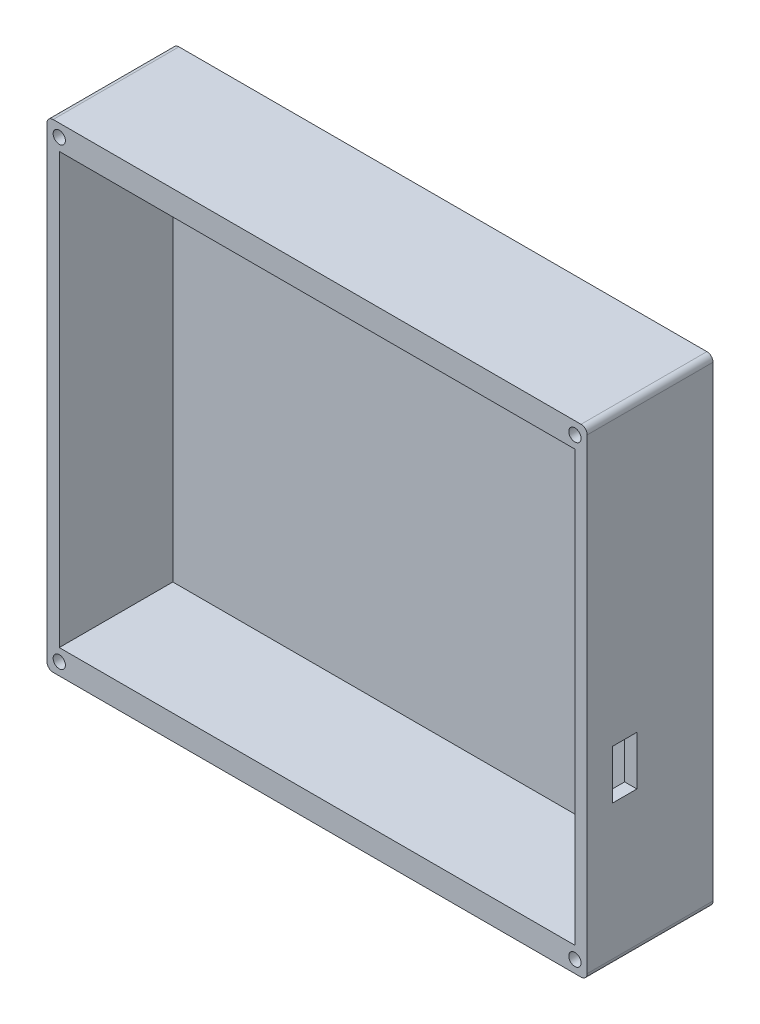
ISO-10303-21;
HEADER;
FILE_DESCRIPTION(('STEP AP214'),'2;1');
FILE_NAME('part.step','',(''),(''),'','','');
FILE_SCHEMA(('AUTOMOTIVE_DESIGN { 1 0 10303 214 1 1 1 1 }'));
ENDSEC;
DATA;
#1=APPLICATION_CONTEXT('core data for automotive mechanical design processes');
#2=APPLICATION_PROTOCOL_DEFINITION('international standard','automotive_design',2000,#1);
#3=PRODUCT_CONTEXT('',#1,'mechanical');
#4=PRODUCT('Part','Part','',(#3));
#5=PRODUCT_RELATED_PRODUCT_CATEGORY('part','',(#4));
#6=PRODUCT_DEFINITION_FORMATION('','',#4);
#7=PRODUCT_DEFINITION_CONTEXT('part definition',#1,'design');
#8=PRODUCT_DEFINITION('design','',#6,#7);
#9=PRODUCT_DEFINITION_SHAPE('','',#8);
#10=(LENGTH_UNIT() NAMED_UNIT(*) SI_UNIT(.MILLI.,.METRE.));
#11=(NAMED_UNIT(*) PLANE_ANGLE_UNIT() SI_UNIT($,.RADIAN.));
#12=(NAMED_UNIT(*) SI_UNIT($,.STERADIAN.) SOLID_ANGLE_UNIT());
#13=UNCERTAINTY_MEASURE_WITH_UNIT(LENGTH_MEASURE(1.E-05),#10,'distance_accuracy_value','');
#14=(GEOMETRIC_REPRESENTATION_CONTEXT(3) GLOBAL_UNCERTAINTY_ASSIGNED_CONTEXT((#13)) GLOBAL_UNIT_ASSIGNED_CONTEXT((#10,
#11,#12)) REPRESENTATION_CONTEXT('',''));
#15=CARTESIAN_POINT('',(0.,0.,0.));
#16=DIRECTION('',(0.,0.,1.));
#17=DIRECTION('',(1.,0.,0.));
#18=AXIS2_PLACEMENT_3D('',#15,#16,#17);
#19=CARTESIAN_POINT('',(44.,39.,20.5));
#20=DIRECTION('',(-1.,0.,0.));
#21=DIRECTION('',(0.,-1.,0.));
#22=AXIS2_PLACEMENT_3D('',#19,#20,#21);
#23=PLANE('',#22);
#24=DIRECTION('',(0.,1.,0.));
#25=VECTOR('',#24,1.);
#26=CARTESIAN_POINT('',(44.,-8.00000000000001,12.4));
#27=LINE('',#26,#25);
#28=CARTESIAN_POINT('',(44.,-16.,12.4));
#29=VERTEX_POINT('',#28);
#30=CARTESIAN_POINT('',(44.,-8.00000000000001,12.4));
#31=VERTEX_POINT('',#30);
#32=EDGE_CURVE('E177',#29,#31,#27,.T.);
#33=ORIENTED_EDGE('',*,*,#32,.F.);
#34=DIRECTION('',(0.,0.,-1.));
#35=VECTOR('',#34,1.);
#36=CARTESIAN_POINT('',(44.,-16.,16.4));
#37=LINE('',#36,#35);
#38=CARTESIAN_POINT('',(44.,-16.,16.4));
#39=VERTEX_POINT('',#38);
#40=EDGE_CURVE('E183',#39,#29,#37,.T.);
#41=ORIENTED_EDGE('',*,*,#40,.F.);
#42=DIRECTION('',(0.,-1.,0.));
#43=VECTOR('',#42,1.);
#44=CARTESIAN_POINT('',(44.,-8.00000000000001,16.4));
#45=LINE('',#44,#43);
#46=CARTESIAN_POINT('',(44.,-8.00000000000001,16.4));
#47=VERTEX_POINT('',#46);
#48=EDGE_CURVE('E187',#47,#39,#45,.T.);
#49=ORIENTED_EDGE('',*,*,#48,.F.);
#50=DIRECTION('',(0.,0.,1.));
#51=VECTOR('',#50,1.);
#52=CARTESIAN_POINT('',(44.,-8.00000000000001,16.4));
#53=LINE('',#52,#51);
#54=EDGE_CURVE('E165',#31,#47,#53,.T.);
#55=ORIENTED_EDGE('',*,*,#54,.F.);
#56=EDGE_LOOP('',(#33,#41,#49,#55));
#57=FACE_BOUND('',#56,.T.);
#58=DIRECTION('',(0.,1.,0.));
#59=VECTOR('',#58,1.);
#60=CARTESIAN_POINT('',(44.,39.,20.5));
#61=LINE('',#60,#59);
#62=CARTESIAN_POINT('',(44.,-38.,20.5));
#63=VERTEX_POINT('',#62);
#64=CARTESIAN_POINT('',(44.,38.,20.5));
#65=VERTEX_POINT('',#64);
#66=EDGE_CURVE('E246',#63,#65,#61,.T.);
#67=ORIENTED_EDGE('',*,*,#66,.F.);
#68=DIRECTION('',(0.,0.,-1.));
#69=VECTOR('',#68,1.);
#70=CARTESIAN_POINT('',(44.,-38.,20.5));
#71=LINE('',#70,#69);
#72=CARTESIAN_POINT('',(44.,-38.,0.));
#73=VERTEX_POINT('',#72);
#74=EDGE_CURVE('E327',#63,#73,#71,.T.);
#75=ORIENTED_EDGE('',*,*,#74,.T.);
#76=DIRECTION('',(0.,1.,0.));
#77=VECTOR('',#76,1.);
#78=CARTESIAN_POINT('',(44.,39.,0.));
#79=LINE('',#78,#77);
#80=CARTESIAN_POINT('',(44.,38.,0.));
#81=VERTEX_POINT('',#80);
#82=EDGE_CURVE('E236',#73,#81,#79,.T.);
#83=ORIENTED_EDGE('',*,*,#82,.T.);
#84=DIRECTION('',(0.,0.,-1.));
#85=VECTOR('',#84,1.);
#86=CARTESIAN_POINT('',(44.,38.,20.5));
#87=LINE('',#86,#85);
#88=EDGE_CURVE('E324',#81,#65,#87,.F.);
#89=ORIENTED_EDGE('',*,*,#88,.T.);
#90=EDGE_LOOP('',(#67,#75,#83,#89));
#91=FACE_BOUND('',#90,.T.);
#92=ADVANCED_FACE('F45',(#57,#91),#23,.F.);
#93=CARTESIAN_POINT('',(-44.,39.,20.5));
#94=DIRECTION('',(0.,-1.,0.));
#95=DIRECTION('',(0.,0.,-1.));
#96=AXIS2_PLACEMENT_3D('',#93,#94,#95);
#97=PLANE('',#96);
#98=DIRECTION('',(-1.,0.,0.));
#99=VECTOR('',#98,1.);
#100=CARTESIAN_POINT('',(-44.,39.,20.5));
#101=LINE('',#100,#99);
#102=CARTESIAN_POINT('',(43.,39.,20.5));
#103=VERTEX_POINT('',#102);
#104=CARTESIAN_POINT('',(-43.,39.,20.5));
#105=VERTEX_POINT('',#104);
#106=EDGE_CURVE('E249',#103,#105,#101,.T.);
#107=ORIENTED_EDGE('',*,*,#106,.F.);
#108=DIRECTION('',(0.,0.,-1.));
#109=VECTOR('',#108,1.);
#110=CARTESIAN_POINT('',(43.,39.,20.5));
#111=LINE('',#110,#109);
#112=CARTESIAN_POINT('',(43.,39.,0.));
#113=VERTEX_POINT('',#112);
#114=EDGE_CURVE('E11',#103,#113,#111,.T.);
#115=ORIENTED_EDGE('',*,*,#114,.T.);
#116=DIRECTION('',(-1.,0.,0.));
#117=VECTOR('',#116,1.);
#118=CARTESIAN_POINT('',(-44.,39.,0.));
#119=LINE('',#118,#117);
#120=CARTESIAN_POINT('',(-43.,39.,0.));
#121=VERTEX_POINT('',#120);
#122=EDGE_CURVE('E265',#113,#121,#119,.T.);
#123=ORIENTED_EDGE('',*,*,#122,.T.);
#124=DIRECTION('',(0.,0.,-1.));
#125=VECTOR('',#124,1.);
#126=CARTESIAN_POINT('',(-43.,39.,20.5));
#127=LINE('',#126,#125);
#128=EDGE_CURVE('E54',#121,#105,#127,.F.);
#129=ORIENTED_EDGE('',*,*,#128,.T.);
#130=EDGE_LOOP('',(#107,#115,#123,#129));
#131=FACE_BOUND('',#130,.T.);
#132=ADVANCED_FACE('F344',(#131),#97,.F.);
#133=CARTESIAN_POINT('',(-44.,39.,20.5));
#134=DIRECTION('',(1.,0.,0.));
#135=DIRECTION('',(0.,1.,0.));
#136=AXIS2_PLACEMENT_3D('',#133,#134,#135);
#137=PLANE('',#136);
#138=DIRECTION('',(0.,-1.,0.));
#139=VECTOR('',#138,1.);
#140=CARTESIAN_POINT('',(-44.,39.,0.));
#141=LINE('',#140,#139);
#142=CARTESIAN_POINT('',(-44.,38.,0.));
#143=VERTEX_POINT('',#142);
#144=CARTESIAN_POINT('',(-44.,-38.,0.));
#145=VERTEX_POINT('',#144);
#146=EDGE_CURVE('E268',#143,#145,#141,.T.);
#147=ORIENTED_EDGE('',*,*,#146,.T.);
#148=DIRECTION('',(0.,0.,-1.));
#149=VECTOR('',#148,1.);
#150=CARTESIAN_POINT('',(-44.,-38.,20.5));
#151=LINE('',#150,#149);
#152=CARTESIAN_POINT('',(-44.,-38.,20.5));
#153=VERTEX_POINT('',#152);
#154=EDGE_CURVE('E310',#145,#153,#151,.F.);
#155=ORIENTED_EDGE('',*,*,#154,.T.);
#156=DIRECTION('',(0.,-1.,0.));
#157=VECTOR('',#156,1.);
#158=CARTESIAN_POINT('',(-44.,39.,20.5));
#159=LINE('',#158,#157);
#160=CARTESIAN_POINT('',(-44.,38.,20.5));
#161=VERTEX_POINT('',#160);
#162=EDGE_CURVE('E253',#161,#153,#159,.T.);
#163=ORIENTED_EDGE('',*,*,#162,.F.);
#164=DIRECTION('',(0.,0.,-1.));
#165=VECTOR('',#164,1.);
#166=CARTESIAN_POINT('',(-44.,38.,20.5));
#167=LINE('',#166,#165);
#168=EDGE_CURVE('E306',#161,#143,#167,.T.);
#169=ORIENTED_EDGE('',*,*,#168,.T.);
#170=EDGE_LOOP('',(#147,#155,#163,#169));
#171=FACE_BOUND('',#170,.T.);
#172=ADVANCED_FACE('F352',(#171),#137,.F.);
#173=CARTESIAN_POINT('',(-44.,-39.,20.5));
#174=DIRECTION('',(0.,1.,0.));
#175=DIRECTION('',(0.,0.,1.));
#176=AXIS2_PLACEMENT_3D('',#173,#174,#175);
#177=PLANE('',#176);
#178=DIRECTION('',(1.,0.,0.));
#179=VECTOR('',#178,1.);
#180=CARTESIAN_POINT('',(-44.,-39.,20.5));
#181=LINE('',#180,#179);
#182=CARTESIAN_POINT('',(-43.,-39.,20.5));
#183=VERTEX_POINT('',#182);
#184=CARTESIAN_POINT('',(43.,-39.,20.5));
#185=VERTEX_POINT('',#184);
#186=EDGE_CURVE('E257',#183,#185,#181,.T.);
#187=ORIENTED_EDGE('',*,*,#186,.F.);
#188=DIRECTION('',(0.,0.,-1.));
#189=VECTOR('',#188,1.);
#190=CARTESIAN_POINT('',(-43.,-39.,20.5));
#191=LINE('',#190,#189);
#192=CARTESIAN_POINT('',(-43.,-39.,0.));
#193=VERTEX_POINT('',#192);
#194=EDGE_CURVE('E290',#183,#193,#191,.T.);
#195=ORIENTED_EDGE('',*,*,#194,.T.);
#196=DIRECTION('',(1.,0.,0.));
#197=VECTOR('',#196,1.);
#198=CARTESIAN_POINT('',(-44.,-39.,0.));
#199=LINE('',#198,#197);
#200=CARTESIAN_POINT('',(43.,-39.,0.));
#201=VERTEX_POINT('',#200);
#202=EDGE_CURVE('E250',#193,#201,#199,.T.);
#203=ORIENTED_EDGE('',*,*,#202,.T.);
#204=DIRECTION('',(0.,0.,-1.));
#205=VECTOR('',#204,1.);
#206=CARTESIAN_POINT('',(43.,-39.,20.5));
#207=LINE('',#206,#205);
#208=EDGE_CURVE('E287',#201,#185,#207,.F.);
#209=ORIENTED_EDGE('',*,*,#208,.T.);
#210=EDGE_LOOP('',(#187,#195,#203,#209));
#211=FACE_BOUND('',#210,.T.);
#212=ADVANCED_FACE('F360',(#211),#177,.F.);
#213=CARTESIAN_POINT('',(0.,0.,20.5));
#214=DIRECTION('',(0.,0.,1.));
#215=DIRECTION('',(1.,0.,0.));
#216=AXIS2_PLACEMENT_3D('',#213,#214,#215);
#217=PLANE('',#216);
#218=CARTESIAN_POINT('',(42.,37.,20.5));
#219=DIRECTION('',(0.,0.,1.));
#220=DIRECTION('',(1.,0.,0.));
#221=AXIS2_PLACEMENT_3D('',#218,#219,#220);
#222=CIRCLE('',#221,0.999999999999998);
#223=CARTESIAN_POINT('',(43.,37.,20.5));
#224=VERTEX_POINT('',#223);
#225=EDGE_CURVE('E477',#224,#224,#222,.T.);
#226=ORIENTED_EDGE('',*,*,#225,.F.);
#227=EDGE_LOOP('',(#226));
#228=FACE_BOUND('',#227,.T.);
#229=CARTESIAN_POINT('',(42.,-37.,20.5));
#230=DIRECTION('',(0.,0.,1.));
#231=DIRECTION('',(1.,0.,0.));
#232=AXIS2_PLACEMENT_3D('',#229,#230,#231);
#233=CIRCLE('',#232,0.999999999999998);
#234=CARTESIAN_POINT('',(43.,-37.,20.5));
#235=VERTEX_POINT('',#234);
#236=EDGE_CURVE('E467',#235,#235,#233,.T.);
#237=ORIENTED_EDGE('',*,*,#236,.F.);
#238=EDGE_LOOP('',(#237));
#239=FACE_BOUND('',#238,.T.);
#240=CARTESIAN_POINT('',(-42.,-37.,20.5));
#241=DIRECTION('',(0.,0.,1.));
#242=DIRECTION('',(1.,0.,0.));
#243=AXIS2_PLACEMENT_3D('',#240,#241,#242);
#244=CIRCLE('',#243,0.999999999999998);
#245=CARTESIAN_POINT('',(-41.,-37.,20.5));
#246=VERTEX_POINT('',#245);
#247=EDGE_CURVE('E457',#246,#246,#244,.T.);
#248=ORIENTED_EDGE('',*,*,#247,.F.);
#249=EDGE_LOOP('',(#248));
#250=FACE_BOUND('',#249,.T.);
#251=CARTESIAN_POINT('',(-42.,37.,20.5));
#252=DIRECTION('',(0.,0.,1.));
#253=DIRECTION('',(1.,0.,0.));
#254=AXIS2_PLACEMENT_3D('',#251,#252,#253);
#255=CIRCLE('',#254,0.999999999999998);
#256=CARTESIAN_POINT('',(-41.,37.,20.5));
#257=VERTEX_POINT('',#256);
#258=EDGE_CURVE('E460',#257,#257,#255,.T.);
#259=ORIENTED_EDGE('',*,*,#258,.F.);
#260=EDGE_LOOP('',(#259));
#261=FACE_BOUND('',#260,.T.);
#262=DIRECTION('',(0.,1.,0.));
#263=VECTOR('',#262,1.);
#264=CARTESIAN_POINT('',(42.,35.,20.5));
#265=LINE('',#264,#263);
#266=CARTESIAN_POINT('',(42.,-35.,20.5));
#267=VERTEX_POINT('',#266);
#268=CARTESIAN_POINT('',(42.,35.,20.5));
#269=VERTEX_POINT('',#268);
#270=EDGE_CURVE('E197',#267,#269,#265,.T.);
#271=ORIENTED_EDGE('',*,*,#270,.F.);
#272=DIRECTION('',(1.,0.,0.));
#273=VECTOR('',#272,1.);
#274=CARTESIAN_POINT('',(-42.,-35.,20.5));
#275=LINE('',#274,#273);
#276=CARTESIAN_POINT('',(-42.,-35.,20.5));
#277=VERTEX_POINT('',#276);
#278=EDGE_CURVE('E207',#277,#267,#275,.T.);
#279=ORIENTED_EDGE('',*,*,#278,.F.);
#280=DIRECTION('',(0.,-1.,0.));
#281=VECTOR('',#280,1.);
#282=CARTESIAN_POINT('',(-42.,35.,20.5));
#283=LINE('',#282,#281);
#284=CARTESIAN_POINT('',(-42.,35.,20.5));
#285=VERTEX_POINT('',#284);
#286=EDGE_CURVE('E226',#285,#277,#283,.T.);
#287=ORIENTED_EDGE('',*,*,#286,.F.);
#288=DIRECTION('',(-1.,0.,0.));
#289=VECTOR('',#288,1.);
#290=CARTESIAN_POINT('',(-42.,35.,20.5));
#291=LINE('',#290,#289);
#292=EDGE_CURVE('E222',#269,#285,#291,.T.);
#293=ORIENTED_EDGE('',*,*,#292,.F.);
#294=EDGE_LOOP('',(#271,#279,#287,#293));
#295=FACE_BOUND('',#294,.T.);
#296=ORIENTED_EDGE('',*,*,#162,.T.);
#297=CARTESIAN_POINT('',(-43.,-38.,20.5));
#298=DIRECTION('',(0.,0.,1.));
#299=DIRECTION('',(1.,0.,0.));
#300=AXIS2_PLACEMENT_3D('',#297,#298,#299);
#301=CIRCLE('',#300,1.);
#302=EDGE_CURVE('E321',#153,#183,#301,.T.);
#303=ORIENTED_EDGE('',*,*,#302,.T.);
#304=ORIENTED_EDGE('',*,*,#186,.T.);
#305=CARTESIAN_POINT('',(43.,-38.,20.5));
#306=DIRECTION('',(0.,0.,1.));
#307=DIRECTION('',(1.,0.,0.));
#308=AXIS2_PLACEMENT_3D('',#305,#306,#307);
#309=CIRCLE('',#308,1.);
#310=EDGE_CURVE('E318',#185,#63,#309,.T.);
#311=ORIENTED_EDGE('',*,*,#310,.T.);
#312=ORIENTED_EDGE('',*,*,#66,.T.);
#313=CARTESIAN_POINT('',(43.,38.,20.5));
#314=DIRECTION('',(0.,0.,1.));
#315=DIRECTION('',(1.,0.,0.));
#316=AXIS2_PLACEMENT_3D('',#313,#314,#315);
#317=CIRCLE('',#316,1.);
#318=EDGE_CURVE('E67',#65,#103,#317,.T.);
#319=ORIENTED_EDGE('',*,*,#318,.T.);
#320=ORIENTED_EDGE('',*,*,#106,.T.);
#321=CARTESIAN_POINT('',(-43.,38.,20.5));
#322=DIRECTION('',(0.,0.,1.));
#323=DIRECTION('',(1.,0.,0.));
#324=AXIS2_PLACEMENT_3D('',#321,#322,#323);
#325=CIRCLE('',#324,1.);
#326=EDGE_CURVE('E313',#105,#161,#325,.T.);
#327=ORIENTED_EDGE('',*,*,#326,.T.);
#328=EDGE_LOOP('',(#296,#303,#304,#311,#312,#319,#320,#327));
#329=FACE_BOUND('',#328,.T.);
#330=ADVANCED_FACE('F346',(#228,#239,#250,#261,#295,#329),#217,.T.);
#331=CARTESIAN_POINT('',(0.,0.,0.));
#332=DIRECTION('',(0.,0.,1.));
#333=DIRECTION('',(1.,0.,0.));
#334=AXIS2_PLACEMENT_3D('',#331,#332,#333);
#335=PLANE('',#334);
#336=ORIENTED_EDGE('',*,*,#202,.F.);
#337=CARTESIAN_POINT('',(-43.,-38.,0.));
#338=DIRECTION('',(0.,0.,1.));
#339=DIRECTION('',(1.,0.,0.));
#340=AXIS2_PLACEMENT_3D('',#337,#338,#339);
#341=CIRCLE('',#340,1.);
#342=EDGE_CURVE('E303',#193,#145,#341,.F.);
#343=ORIENTED_EDGE('',*,*,#342,.T.);
#344=ORIENTED_EDGE('',*,*,#146,.F.);
#345=CARTESIAN_POINT('',(-43.,38.,0.));
#346=DIRECTION('',(0.,0.,1.));
#347=DIRECTION('',(1.,0.,0.));
#348=AXIS2_PLACEMENT_3D('',#345,#346,#347);
#349=CIRCLE('',#348,1.);
#350=EDGE_CURVE('E294',#143,#121,#349,.F.);
#351=ORIENTED_EDGE('',*,*,#350,.T.);
#352=ORIENTED_EDGE('',*,*,#122,.F.);
#353=CARTESIAN_POINT('',(43.,38.,0.));
#354=DIRECTION('',(0.,0.,1.));
#355=DIRECTION('',(1.,0.,0.));
#356=AXIS2_PLACEMENT_3D('',#353,#354,#355);
#357=CIRCLE('',#356,1.);
#358=EDGE_CURVE('E297',#113,#81,#357,.F.);
#359=ORIENTED_EDGE('',*,*,#358,.T.);
#360=ORIENTED_EDGE('',*,*,#82,.F.);
#361=CARTESIAN_POINT('',(43.,-38.,0.));
#362=DIRECTION('',(0.,0.,1.));
#363=DIRECTION('',(1.,0.,0.));
#364=AXIS2_PLACEMENT_3D('',#361,#362,#363);
#365=CIRCLE('',#364,1.);
#366=EDGE_CURVE('E300',#73,#201,#365,.F.);
#367=ORIENTED_EDGE('',*,*,#366,.T.);
#368=EDGE_LOOP('',(#336,#343,#344,#351,#352,#359,#360,#367));
#369=FACE_BOUND('',#368,.T.);
#370=ADVANCED_FACE('F339',(#369),#335,.F.);
#371=CARTESIAN_POINT('',(42.,35.,2.));
#372=DIRECTION('',(1.,0.,0.));
#373=DIRECTION('',(0.,0.,-1.));
#374=AXIS2_PLACEMENT_3D('',#371,#372,#373);
#375=PLANE('',#374);
#376=DIRECTION('',(0.,-1.,0.));
#377=VECTOR('',#376,1.);
#378=CARTESIAN_POINT('',(42.,35.,16.4));
#379=LINE('',#378,#377);
#380=CARTESIAN_POINT('',(42.,-8.00000000000001,16.4));
#381=VERTEX_POINT('',#380);
#382=CARTESIAN_POINT('',(42.,-16.,16.4));
#383=VERTEX_POINT('',#382);
#384=EDGE_CURVE('E279',#381,#383,#379,.T.);
#385=ORIENTED_EDGE('',*,*,#384,.T.);
#386=DIRECTION('',(0.,0.,-1.));
#387=VECTOR('',#386,1.);
#388=CARTESIAN_POINT('',(42.,-16.,2.));
#389=LINE('',#388,#387);
#390=CARTESIAN_POINT('',(42.,-16.,12.4));
#391=VERTEX_POINT('',#390);
#392=EDGE_CURVE('E283',#383,#391,#389,.T.);
#393=ORIENTED_EDGE('',*,*,#392,.T.);
#394=DIRECTION('',(0.,1.,0.));
#395=VECTOR('',#394,1.);
#396=CARTESIAN_POINT('',(42.,35.,12.4));
#397=LINE('',#396,#395);
#398=CARTESIAN_POINT('',(42.,-8.00000000000001,12.4));
#399=VERTEX_POINT('',#398);
#400=EDGE_CURVE('E261',#391,#399,#397,.T.);
#401=ORIENTED_EDGE('',*,*,#400,.T.);
#402=DIRECTION('',(0.,0.,1.));
#403=VECTOR('',#402,1.);
#404=CARTESIAN_POINT('',(42.,-8.,1.99999999999998));
#405=LINE('',#404,#403);
#406=EDGE_CURVE('E168',#399,#381,#405,.T.);
#407=ORIENTED_EDGE('',*,*,#406,.T.);
#408=EDGE_LOOP('',(#385,#393,#401,#407));
#409=FACE_BOUND('',#408,.T.);
#410=ORIENTED_EDGE('',*,*,#270,.T.);
#411=DIRECTION('',(0.,0.,1.));
#412=VECTOR('',#411,1.);
#413=CARTESIAN_POINT('',(42.,35.,2.));
#414=LINE('',#413,#412);
#415=CARTESIAN_POINT('',(42.,35.,2.));
#416=VERTEX_POINT('',#415);
#417=EDGE_CURVE('E219',#416,#269,#414,.T.);
#418=ORIENTED_EDGE('',*,*,#417,.F.);
#419=DIRECTION('',(0.,1.,0.));
#420=VECTOR('',#419,1.);
#421=CARTESIAN_POINT('',(42.,35.,2.));
#422=LINE('',#421,#420);
#423=CARTESIAN_POINT('',(42.,-35.,2.));
#424=VERTEX_POINT('',#423);
#425=EDGE_CURVE('E202',#424,#416,#422,.T.);
#426=ORIENTED_EDGE('',*,*,#425,.F.);
#427=DIRECTION('',(0.,0.,1.));
#428=VECTOR('',#427,1.);
#429=CARTESIAN_POINT('',(42.,-35.,2.));
#430=LINE('',#429,#428);
#431=EDGE_CURVE('E233',#424,#267,#430,.T.);
#432=ORIENTED_EDGE('',*,*,#431,.T.);
#433=EDGE_LOOP('',(#410,#418,#426,#432));
#434=FACE_BOUND('',#433,.T.);
#435=ADVANCED_FACE('F385',(#409,#434),#375,.F.);
#436=CARTESIAN_POINT('',(-42.,-35.,2.));
#437=DIRECTION('',(0.,-1.,0.));
#438=DIRECTION('',(0.,0.,-1.));
#439=AXIS2_PLACEMENT_3D('',#436,#437,#438);
#440=PLANE('',#439);
#441=ORIENTED_EDGE('',*,*,#278,.T.);
#442=ORIENTED_EDGE('',*,*,#431,.F.);
#443=DIRECTION('',(1.,0.,0.));
#444=VECTOR('',#443,1.);
#445=CARTESIAN_POINT('',(-42.,-35.,2.));
#446=LINE('',#445,#444);
#447=CARTESIAN_POINT('',(-42.,-35.,2.));
#448=VERTEX_POINT('',#447);
#449=EDGE_CURVE('E215',#448,#424,#446,.T.);
#450=ORIENTED_EDGE('',*,*,#449,.F.);
#451=DIRECTION('',(0.,0.,1.));
#452=VECTOR('',#451,1.);
#453=CARTESIAN_POINT('',(-42.,-35.,2.));
#454=LINE('',#453,#452);
#455=EDGE_CURVE('E237',#448,#277,#454,.T.);
#456=ORIENTED_EDGE('',*,*,#455,.T.);
#457=EDGE_LOOP('',(#441,#442,#450,#456));
#458=FACE_BOUND('',#457,.T.);
#459=ADVANCED_FACE('F391',(#458),#440,.F.);
#460=CARTESIAN_POINT('',(-42.,35.,2.));
#461=DIRECTION('',(-1.,0.,0.));
#462=DIRECTION('',(0.,-1.,0.));
#463=AXIS2_PLACEMENT_3D('',#460,#461,#462);
#464=PLANE('',#463);
#465=ORIENTED_EDGE('',*,*,#286,.T.);
#466=ORIENTED_EDGE('',*,*,#455,.F.);
#467=DIRECTION('',(0.,-1.,0.));
#468=VECTOR('',#467,1.);
#469=CARTESIAN_POINT('',(-42.,35.,2.));
#470=LINE('',#469,#468);
#471=CARTESIAN_POINT('',(-42.,35.,2.));
#472=VERTEX_POINT('',#471);
#473=EDGE_CURVE('E211',#472,#448,#470,.T.);
#474=ORIENTED_EDGE('',*,*,#473,.F.);
#475=DIRECTION('',(0.,0.,1.));
#476=VECTOR('',#475,1.);
#477=CARTESIAN_POINT('',(-42.,35.,2.));
#478=LINE('',#477,#476);
#479=EDGE_CURVE('E240',#472,#285,#478,.T.);
#480=ORIENTED_EDGE('',*,*,#479,.T.);
#481=EDGE_LOOP('',(#465,#466,#474,#480));
#482=FACE_BOUND('',#481,.T.);
#483=ADVANCED_FACE('F397',(#482),#464,.F.);
#484=CARTESIAN_POINT('',(-42.,35.,2.));
#485=DIRECTION('',(0.,1.,0.));
#486=DIRECTION('',(0.,0.,1.));
#487=AXIS2_PLACEMENT_3D('',#484,#485,#486);
#488=PLANE('',#487);
#489=ORIENTED_EDGE('',*,*,#292,.T.);
#490=ORIENTED_EDGE('',*,*,#479,.F.);
#491=DIRECTION('',(-1.,0.,0.));
#492=VECTOR('',#491,1.);
#493=CARTESIAN_POINT('',(-42.,35.,2.));
#494=LINE('',#493,#492);
#495=EDGE_CURVE('E206',#416,#472,#494,.T.);
#496=ORIENTED_EDGE('',*,*,#495,.F.);
#497=ORIENTED_EDGE('',*,*,#417,.T.);
#498=EDGE_LOOP('',(#489,#490,#496,#497));
#499=FACE_BOUND('',#498,.T.);
#500=ADVANCED_FACE('F393',(#499),#488,.F.);
#501=CARTESIAN_POINT('',(0.,0.,2.));
#502=DIRECTION('',(0.,0.,1.));
#503=DIRECTION('',(1.,0.,0.));
#504=AXIS2_PLACEMENT_3D('',#501,#502,#503);
#505=PLANE('',#504);
#506=ORIENTED_EDGE('',*,*,#425,.T.);
#507=ORIENTED_EDGE('',*,*,#495,.T.);
#508=ORIENTED_EDGE('',*,*,#473,.T.);
#509=ORIENTED_EDGE('',*,*,#449,.T.);
#510=EDGE_LOOP('',(#506,#507,#508,#509));
#511=FACE_BOUND('',#510,.T.);
#512=ADVANCED_FACE('F396',(#511),#505,.T.);
#513=CARTESIAN_POINT('',(25.5,-16.,16.4));
#514=DIRECTION('',(0.,-1.,0.));
#515=DIRECTION('',(1.,0.,0.));
#516=AXIS2_PLACEMENT_3D('',#513,#514,#515);
#517=PLANE('',#516);
#518=DIRECTION('',(1.,0.,0.));
#519=VECTOR('',#518,1.);
#520=CARTESIAN_POINT('',(25.5,-16.,16.4));
#521=LINE('',#520,#519);
#522=EDGE_CURVE('E194',#383,#39,#521,.T.);
#523=ORIENTED_EDGE('',*,*,#522,.T.);
#524=ORIENTED_EDGE('',*,*,#40,.T.);
#525=DIRECTION('',(1.,0.,0.));
#526=VECTOR('',#525,1.);
#527=CARTESIAN_POINT('',(25.5,-16.,12.4));
#528=LINE('',#527,#526);
#529=EDGE_CURVE('E173',#391,#29,#528,.T.);
#530=ORIENTED_EDGE('',*,*,#529,.F.);
#531=ORIENTED_EDGE('',*,*,#392,.F.);
#532=EDGE_LOOP('',(#523,#524,#530,#531));
#533=FACE_BOUND('',#532,.T.);
#534=ADVANCED_FACE('F407',(#533),#517,.F.);
#535=CARTESIAN_POINT('',(25.5,-8.00000000000001,16.4));
#536=DIRECTION('',(0.,0.,1.));
#537=DIRECTION('',(1.,0.,0.));
#538=AXIS2_PLACEMENT_3D('',#535,#536,#537);
#539=PLANE('',#538);
#540=DIRECTION('',(1.,0.,0.));
#541=VECTOR('',#540,1.);
#542=CARTESIAN_POINT('',(25.5,-8.00000000000001,16.4));
#543=LINE('',#542,#541);
#544=EDGE_CURVE('E172',#381,#47,#543,.T.);
#545=ORIENTED_EDGE('',*,*,#544,.T.);
#546=ORIENTED_EDGE('',*,*,#48,.T.);
#547=ORIENTED_EDGE('',*,*,#522,.F.);
#548=ORIENTED_EDGE('',*,*,#384,.F.);
#549=EDGE_LOOP('',(#545,#546,#547,#548));
#550=FACE_BOUND('',#549,.T.);
#551=ADVANCED_FACE('F411',(#550),#539,.F.);
#552=CARTESIAN_POINT('',(25.5,-8.00000000000001,16.4));
#553=DIRECTION('',(0.,1.,0.));
#554=DIRECTION('',(0.,0.,1.));
#555=AXIS2_PLACEMENT_3D('',#552,#553,#554);
#556=PLANE('',#555);
#557=DIRECTION('',(1.,0.,0.));
#558=VECTOR('',#557,1.);
#559=CARTESIAN_POINT('',(25.5,-8.00000000000001,12.4));
#560=LINE('',#559,#558);
#561=EDGE_CURVE('E160',#399,#31,#560,.T.);
#562=ORIENTED_EDGE('',*,*,#561,.T.);
#563=ORIENTED_EDGE('',*,*,#54,.T.);
#564=ORIENTED_EDGE('',*,*,#544,.F.);
#565=ORIENTED_EDGE('',*,*,#406,.F.);
#566=EDGE_LOOP('',(#562,#563,#564,#565));
#567=FACE_BOUND('',#566,.T.);
#568=ADVANCED_FACE('F162',(#567),#556,.F.);
#569=CARTESIAN_POINT('',(25.5,-8.00000000000001,12.4));
#570=DIRECTION('',(0.,0.,-1.));
#571=DIRECTION('',(0.,1.,0.));
#572=AXIS2_PLACEMENT_3D('',#569,#570,#571);
#573=PLANE('',#572);
#574=ORIENTED_EDGE('',*,*,#529,.T.);
#575=ORIENTED_EDGE('',*,*,#32,.T.);
#576=ORIENTED_EDGE('',*,*,#561,.F.);
#577=ORIENTED_EDGE('',*,*,#400,.F.);
#578=EDGE_LOOP('',(#574,#575,#576,#577));
#579=FACE_BOUND('',#578,.T.);
#580=ADVANCED_FACE('F178',(#579),#573,.F.);
#581=CARTESIAN_POINT('',(-42.,37.,10.5));
#582=DIRECTION('',(0.,0.,1.));
#583=DIRECTION('',(1.,0.,0.));
#584=AXIS2_PLACEMENT_3D('',#581,#582,#583);
#585=CYLINDRICAL_SURFACE('',#584,0.999999999999998);
#586=CARTESIAN_POINT('',(-42.,37.,10.5));
#587=DIRECTION('',(0.,0.,1.));
#588=DIRECTION('',(1.,0.,0.));
#589=AXIS2_PLACEMENT_3D('',#586,#587,#588);
#590=CIRCLE('',#589,0.999999999999998);
#591=CARTESIAN_POINT('',(-41.,37.,10.5));
#592=VERTEX_POINT('',#591);
#593=EDGE_CURVE('E465',#592,#592,#590,.T.);
#594=ORIENTED_EDGE('',*,*,#593,.F.);
#595=EDGE_LOOP('',(#594));
#596=FACE_BOUND('',#595,.T.);
#597=ORIENTED_EDGE('',*,*,#258,.T.);
#598=EDGE_LOOP('',(#597));
#599=FACE_BOUND('',#598,.T.);
#600=ADVANCED_FACE('F415',(#596,#599),#585,.F.);
#601=CARTESIAN_POINT('',(-42.,37.,10.5));
#602=DIRECTION('',(0.,0.,1.));
#603=DIRECTION('',(1.,0.,0.));
#604=AXIS2_PLACEMENT_3D('',#601,#602,#603);
#605=PLANE('',#604);
#606=ORIENTED_EDGE('',*,*,#593,.T.);
#607=EDGE_LOOP('',(#606));
#608=FACE_BOUND('',#607,.T.);
#609=ADVANCED_FACE('F423',(#608),#605,.T.);
#610=CARTESIAN_POINT('',(-42.,-37.,10.5));
#611=DIRECTION('',(0.,0.,1.));
#612=DIRECTION('',(1.,0.,0.));
#613=AXIS2_PLACEMENT_3D('',#610,#611,#612);
#614=CYLINDRICAL_SURFACE('',#613,0.999999999999998);
#615=CARTESIAN_POINT('',(-42.,-37.,10.5));
#616=DIRECTION('',(0.,0.,1.));
#617=DIRECTION('',(1.,0.,0.));
#618=AXIS2_PLACEMENT_3D('',#615,#616,#617);
#619=CIRCLE('',#618,0.999999999999998);
#620=CARTESIAN_POINT('',(-41.,-37.,10.5));
#621=VERTEX_POINT('',#620);
#622=EDGE_CURVE('E454',#621,#621,#619,.T.);
#623=ORIENTED_EDGE('',*,*,#622,.F.);
#624=EDGE_LOOP('',(#623));
#625=FACE_BOUND('',#624,.T.);
#626=ORIENTED_EDGE('',*,*,#247,.T.);
#627=EDGE_LOOP('',(#626));
#628=FACE_BOUND('',#627,.T.);
#629=ADVANCED_FACE('F427',(#625,#628),#614,.F.);
#630=CARTESIAN_POINT('',(-42.,-37.,10.5));
#631=DIRECTION('',(0.,0.,1.));
#632=DIRECTION('',(1.,0.,0.));
#633=AXIS2_PLACEMENT_3D('',#630,#631,#632);
#634=PLANE('',#633);
#635=ORIENTED_EDGE('',*,*,#622,.T.);
#636=EDGE_LOOP('',(#635));
#637=FACE_BOUND('',#636,.T.);
#638=ADVANCED_FACE('F442',(#637),#634,.T.);
#639=CARTESIAN_POINT('',(42.,-37.,10.5));
#640=DIRECTION('',(0.,0.,1.));
#641=DIRECTION('',(1.,0.,0.));
#642=AXIS2_PLACEMENT_3D('',#639,#640,#641);
#643=CYLINDRICAL_SURFACE('',#642,0.999999999999998);
#644=CARTESIAN_POINT('',(42.,-37.,10.5));
#645=DIRECTION('',(0.,0.,1.));
#646=DIRECTION('',(1.,0.,0.));
#647=AXIS2_PLACEMENT_3D('',#644,#645,#646);
#648=CIRCLE('',#647,0.999999999999998);
#649=CARTESIAN_POINT('',(43.,-37.,10.5));
#650=VERTEX_POINT('',#649);
#651=EDGE_CURVE('E473',#650,#650,#648,.T.);
#652=ORIENTED_EDGE('',*,*,#651,.F.);
#653=EDGE_LOOP('',(#652));
#654=FACE_BOUND('',#653,.T.);
#655=ORIENTED_EDGE('',*,*,#236,.T.);
#656=EDGE_LOOP('',(#655));
#657=FACE_BOUND('',#656,.T.);
#658=ADVANCED_FACE('F438',(#654,#657),#643,.F.);
#659=CARTESIAN_POINT('',(42.,-37.,10.5));
#660=DIRECTION('',(0.,0.,1.));
#661=DIRECTION('',(1.,0.,0.));
#662=AXIS2_PLACEMENT_3D('',#659,#660,#661);
#663=PLANE('',#662);
#664=ORIENTED_EDGE('',*,*,#651,.T.);
#665=EDGE_LOOP('',(#664));
#666=FACE_BOUND('',#665,.T.);
#667=ADVANCED_FACE('F434',(#666),#663,.T.);
#668=CARTESIAN_POINT('',(42.,37.,10.5));
#669=DIRECTION('',(0.,0.,1.));
#670=DIRECTION('',(1.,0.,0.));
#671=AXIS2_PLACEMENT_3D('',#668,#669,#670);
#672=CYLINDRICAL_SURFACE('',#671,0.999999999999998);
#673=CARTESIAN_POINT('',(42.,37.,10.5));
#674=DIRECTION('',(0.,0.,1.));
#675=DIRECTION('',(1.,0.,0.));
#676=AXIS2_PLACEMENT_3D('',#673,#674,#675);
#677=CIRCLE('',#676,0.999999999999998);
#678=CARTESIAN_POINT('',(43.,37.,10.5));
#679=VERTEX_POINT('',#678);
#680=EDGE_CURVE('E481',#679,#679,#677,.T.);
#681=ORIENTED_EDGE('',*,*,#680,.F.);
#682=EDGE_LOOP('',(#681));
#683=FACE_BOUND('',#682,.T.);
#684=ORIENTED_EDGE('',*,*,#225,.T.);
#685=EDGE_LOOP('',(#684));
#686=FACE_BOUND('',#685,.T.);
#687=ADVANCED_FACE('F430',(#683,#686),#672,.F.);
#688=CARTESIAN_POINT('',(42.,37.,10.5));
#689=DIRECTION('',(0.,0.,1.));
#690=DIRECTION('',(1.,0.,0.));
#691=AXIS2_PLACEMENT_3D('',#688,#689,#690);
#692=PLANE('',#691);
#693=ORIENTED_EDGE('',*,*,#680,.T.);
#694=EDGE_LOOP('',(#693));
#695=FACE_BOUND('',#694,.T.);
#696=ADVANCED_FACE('F369',(#695),#692,.T.);
#697=CARTESIAN_POINT('',(-43.,-38.,20.5));
#698=DIRECTION('',(0.,0.,-1.));
#699=DIRECTION('',(-1.,0.,0.));
#700=AXIS2_PLACEMENT_3D('',#697,#698,#699);
#701=CYLINDRICAL_SURFACE('',#700,1.);
#702=ORIENTED_EDGE('',*,*,#302,.F.);
#703=ORIENTED_EDGE('',*,*,#154,.F.);
#704=ORIENTED_EDGE('',*,*,#342,.F.);
#705=ORIENTED_EDGE('',*,*,#194,.F.);
#706=EDGE_LOOP('',(#702,#703,#704,#705));
#707=FACE_BOUND('',#706,.T.);
#708=ADVANCED_FACE('F357',(#707),#701,.T.);
#709=CARTESIAN_POINT('',(43.,-38.,20.5));
#710=DIRECTION('',(0.,0.,-1.));
#711=DIRECTION('',(-1.,0.,0.));
#712=AXIS2_PLACEMENT_3D('',#709,#710,#711);
#713=CYLINDRICAL_SURFACE('',#712,1.);
#714=ORIENTED_EDGE('',*,*,#310,.F.);
#715=ORIENTED_EDGE('',*,*,#208,.F.);
#716=ORIENTED_EDGE('',*,*,#366,.F.);
#717=ORIENTED_EDGE('',*,*,#74,.F.);
#718=EDGE_LOOP('',(#714,#715,#716,#717));
#719=FACE_BOUND('',#718,.T.);
#720=ADVANCED_FACE('F362',(#719),#713,.T.);
#721=CARTESIAN_POINT('',(43.,38.,20.5));
#722=DIRECTION('',(0.,0.,-1.));
#723=DIRECTION('',(-1.,0.,0.));
#724=AXIS2_PLACEMENT_3D('',#721,#722,#723);
#725=CYLINDRICAL_SURFACE('',#724,1.);
#726=ORIENTED_EDGE('',*,*,#318,.F.);
#727=ORIENTED_EDGE('',*,*,#88,.F.);
#728=ORIENTED_EDGE('',*,*,#358,.F.);
#729=ORIENTED_EDGE('',*,*,#114,.F.);
#730=EDGE_LOOP('',(#726,#727,#728,#729));
#731=FACE_BOUND('',#730,.T.);
#732=ADVANCED_FACE('F343',(#731),#725,.T.);
#733=CARTESIAN_POINT('',(-43.,38.,20.5));
#734=DIRECTION('',(0.,0.,-1.));
#735=DIRECTION('',(-1.,0.,0.));
#736=AXIS2_PLACEMENT_3D('',#733,#734,#735);
#737=CYLINDRICAL_SURFACE('',#736,1.);
#738=ORIENTED_EDGE('',*,*,#326,.F.);
#739=ORIENTED_EDGE('',*,*,#128,.F.);
#740=ORIENTED_EDGE('',*,*,#350,.F.);
#741=ORIENTED_EDGE('',*,*,#168,.F.);
#742=EDGE_LOOP('',(#738,#739,#740,#741));
#743=FACE_BOUND('',#742,.T.);
#744=ADVANCED_FACE('F47',(#743),#737,.T.);
#745=CLOSED_SHELL('',(#92,#132,#172,#212,#330,#370,#435,#459,#483,#500,#512,#534,#551,#568,#580,
#600,#609,#629,#638,#658,#667,#687,#696,#708,#720,#732,#744));
#746=MANIFOLD_SOLID_BREP('B2',#745);
#747=ADVANCED_BREP_SHAPE_REPRESENTATION('',(#18,#746),#14);
#748=SHAPE_DEFINITION_REPRESENTATION(#9,#747);
ENDSEC;
END-ISO-10303-21;
